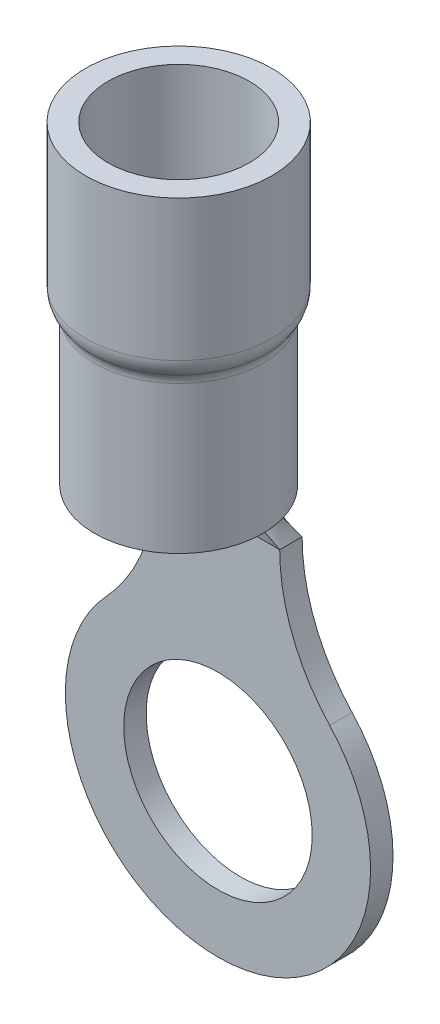
ISO-10303-21;
HEADER;
FILE_DESCRIPTION(('STEP AP214'),'2;1');
FILE_NAME('part.step','',(''),(''),'','','');
FILE_SCHEMA(('AUTOMOTIVE_DESIGN { 1 0 10303 214 1 1 1 1 }'));
ENDSEC;
DATA;
#1=APPLICATION_CONTEXT('core data for automotive mechanical design processes');
#2=APPLICATION_PROTOCOL_DEFINITION('international standard','automotive_design',2000,#1);
#3=PRODUCT_CONTEXT('',#1,'mechanical');
#4=PRODUCT('Part','Part','',(#3));
#5=PRODUCT_RELATED_PRODUCT_CATEGORY('part','',(#4));
#6=PRODUCT_DEFINITION_FORMATION('','',#4);
#7=PRODUCT_DEFINITION_CONTEXT('part definition',#1,'design');
#8=PRODUCT_DEFINITION('design','',#6,#7);
#9=PRODUCT_DEFINITION_SHAPE('','',#8);
#10=(LENGTH_UNIT() NAMED_UNIT(*) SI_UNIT(.MILLI.,.METRE.));
#11=(NAMED_UNIT(*) PLANE_ANGLE_UNIT() SI_UNIT($,.RADIAN.));
#12=(NAMED_UNIT(*) SI_UNIT($,.STERADIAN.) SOLID_ANGLE_UNIT());
#13=UNCERTAINTY_MEASURE_WITH_UNIT(LENGTH_MEASURE(1.E-05),#10,'distance_accuracy_value','');
#14=(GEOMETRIC_REPRESENTATION_CONTEXT(3) GLOBAL_UNCERTAINTY_ASSIGNED_CONTEXT((#13)) GLOBAL_UNIT_ASSIGNED_CONTEXT((#10,
#11,#12)) REPRESENTATION_CONTEXT('',''));
#15=CARTESIAN_POINT('',(0.,0.,0.));
#16=DIRECTION('',(0.,0.,1.));
#17=DIRECTION('',(1.,0.,0.));
#18=AXIS2_PLACEMENT_3D('',#15,#16,#17);
#19=CARTESIAN_POINT('',(0.,8.560050506339,2.75));
#20=DIRECTION('',(0.,1.,0.));
#21=DIRECTION('',(1.,0.,0.));
#22=AXIS2_PLACEMENT_3D('',#19,#20,#21);
#23=TOROIDAL_SURFACE('',#22,4.450000809119,0.7);
#24=CARTESIAN_POINT('',(0.,8.989699593222,2.75));
#25=DIRECTION('',(0.,-1.,0.));
#26=DIRECTION('',(1.,0.,0.));
#27=AXIS2_PLACEMENT_3D('',#24,#25,#26);
#28=CIRCLE('',#27,3.897369230189);
#29=CARTESIAN_POINT('',(3.897369230189,8.989699593222,2.75));
#30=VERTEX_POINT('',#29);
#31=EDGE_CURVE('P0_E27',#30,#30,#28,.T.);
#32=ORIENTED_EDGE('',*,*,#31,.T.);
#33=CARTESIAN_POINT('',(4.450000809119,8.560050506339,2.75));
#34=DIRECTION('',(0.,0.,1.));
#35=DIRECTION('',(1.,0.,0.));
#36=AXIS2_PLACEMENT_3D('',#33,#34,#35);
#37=CIRCLE('',#36,0.7);
#38=CARTESIAN_POINT('',(3.750000809119,8.560050506339,2.75));
#39=VERTEX_POINT('',#38);
#40=EDGE_CURVE('P0_E11',#30,#39,#37,.T.);
#41=ORIENTED_EDGE('',*,*,#40,.T.);
#42=CARTESIAN_POINT('',(0.,8.560050506339,2.75));
#43=DIRECTION('',(0.,-1.,0.));
#44=DIRECTION('',(1.,0.,0.));
#45=AXIS2_PLACEMENT_3D('',#42,#43,#44);
#46=CIRCLE('',#45,3.750000809119);
#47=EDGE_CURVE('P0_E122',#39,#39,#46,.T.);
#48=ORIENTED_EDGE('',*,*,#47,.F.);
#49=ORIENTED_EDGE('',*,*,#40,.F.);
#50=EDGE_LOOP('',(#32,#41,#48,#49));
#51=FACE_BOUND('',#50,.T.);
#52=ADVANCED_FACE('P0_F16',(#51),#23,.F.);
#53=CARTESIAN_POINT('',(0.,9.726240885055,2.75));
#54=DIRECTION('',(0.,-1.,0.));
#55=DIRECTION('',(1.,0.,0.));
#56=AXIS2_PLACEMENT_3D('',#53,#54,#55);
#57=TOROIDAL_SURFACE('',#56,2.950000809121,1.2);
#58=CARTESIAN_POINT('',(0.,9.726240885055,2.75));
#59=DIRECTION('',(0.,-1.,0.));
#60=DIRECTION('',(1.,0.,0.));
#61=AXIS2_PLACEMENT_3D('',#58,#59,#60);
#62=CIRCLE('',#61,4.150000809121);
#63=CARTESIAN_POINT('',(4.150000809121,9.726240885055,2.75));
#64=VERTEX_POINT('',#63);
#65=EDGE_CURVE('P0_E103',#64,#64,#62,.T.);
#66=ORIENTED_EDGE('',*,*,#65,.T.);
#67=CARTESIAN_POINT('',(2.950000809121,9.726240885055,2.75));
#68=DIRECTION('',(0.,0.,-1.));
#69=DIRECTION('',(1.,0.,0.));
#70=AXIS2_PLACEMENT_3D('',#67,#68,#69);
#71=CIRCLE('',#70,1.2);
#72=EDGE_CURVE('P0_E101',#64,#30,#71,.T.);
#73=ORIENTED_EDGE('',*,*,#72,.T.);
#74=ORIENTED_EDGE('',*,*,#31,.F.);
#75=ORIENTED_EDGE('',*,*,#72,.F.);
#76=EDGE_LOOP('',(#66,#73,#74,#75));
#77=FACE_BOUND('',#76,.T.);
#78=ADVANCED_FACE('P0_F167',(#77),#57,.T.);
#79=CARTESIAN_POINT('',(0.,9.726240885055,2.75));
#80=DIRECTION('',(0.,-1.,0.));
#81=DIRECTION('',(1.,0.,0.));
#82=AXIS2_PLACEMENT_3D('',#79,#80,#81);
#83=CYLINDRICAL_SURFACE('',#82,4.150000809121);
#84=CARTESIAN_POINT('',(0.,16.,2.75));
#85=DIRECTION('',(0.,-1.,0.));
#86=DIRECTION('',(1.,0.,0.));
#87=AXIS2_PLACEMENT_3D('',#84,#85,#86);
#88=CIRCLE('',#87,4.150000809121);
#89=CARTESIAN_POINT('',(4.150000809121,16.,2.75));
#90=VERTEX_POINT('',#89);
#91=EDGE_CURVE('P0_E95',#90,#90,#88,.T.);
#92=ORIENTED_EDGE('',*,*,#91,.T.);
#93=DIRECTION('',(0.,-1.,0.));
#94=VECTOR('',#93,1.);
#95=CARTESIAN_POINT('',(4.150000809121,9.726240885055,2.75));
#96=LINE('',#95,#94);
#97=EDGE_CURVE('P0_E112',#90,#64,#96,.T.);
#98=ORIENTED_EDGE('',*,*,#97,.T.);
#99=ORIENTED_EDGE('',*,*,#65,.F.);
#100=ORIENTED_EDGE('',*,*,#97,.F.);
#101=EDGE_LOOP('',(#92,#98,#99,#100));
#102=FACE_BOUND('',#101,.T.);
#103=ADVANCED_FACE('P0_F171',(#102),#83,.T.);
#104=CARTESIAN_POINT('',(0.,16.,2.75));
#105=DIRECTION('',(0.,-1.,0.));
#106=DIRECTION('',(-1.,0.,0.));
#107=AXIS2_PLACEMENT_3D('',#104,#105,#106);
#108=PLANE('',#107);
#109=ORIENTED_EDGE('',*,*,#91,.F.);
#110=EDGE_LOOP('',(#109));
#111=FACE_BOUND('',#110,.T.);
#112=CARTESIAN_POINT('',(0.,16.,2.75));
#113=DIRECTION('',(0.,-1.,0.));
#114=DIRECTION('',(1.,0.,0.));
#115=AXIS2_PLACEMENT_3D('',#112,#113,#114);
#116=CIRCLE('',#115,3.150000809121);
#117=CARTESIAN_POINT('',(3.150000809121,16.,2.75));
#118=VERTEX_POINT('',#117);
#119=EDGE_CURVE('P0_E88',#118,#118,#116,.T.);
#120=ORIENTED_EDGE('',*,*,#119,.T.);
#121=EDGE_LOOP('',(#120));
#122=FACE_BOUND('',#121,.T.);
#123=ADVANCED_FACE('P0_F162',(#111,#122),#108,.F.);
#124=CARTESIAN_POINT('',(0.,9.900000000002,2.75));
#125=DIRECTION('',(0.,1.,0.));
#126=DIRECTION('',(1.,0.,0.));
#127=AXIS2_PLACEMENT_3D('',#124,#125,#126);
#128=CYLINDRICAL_SURFACE('',#127,3.150000809121);
#129=CARTESIAN_POINT('',(0.,9.900000000002,2.75));
#130=DIRECTION('',(0.,-1.,0.));
#131=DIRECTION('',(1.,0.,0.));
#132=AXIS2_PLACEMENT_3D('',#129,#130,#131);
#133=CIRCLE('',#132,3.150000809121);
#134=CARTESIAN_POINT('',(3.150000809121,9.900000000002,2.75));
#135=VERTEX_POINT('',#134);
#136=EDGE_CURVE('P0_E87',#135,#135,#133,.T.);
#137=ORIENTED_EDGE('',*,*,#136,.T.);
#138=DIRECTION('',(0.,1.,0.));
#139=VECTOR('',#138,1.);
#140=CARTESIAN_POINT('',(3.150000809121,9.900000000002,2.75));
#141=LINE('',#140,#139);
#142=EDGE_CURVE('P0_E84',#135,#118,#141,.T.);
#143=ORIENTED_EDGE('',*,*,#142,.T.);
#144=ORIENTED_EDGE('',*,*,#119,.F.);
#145=ORIENTED_EDGE('',*,*,#142,.F.);
#146=EDGE_LOOP('',(#137,#143,#144,#145));
#147=FACE_BOUND('',#146,.T.);
#148=ADVANCED_FACE('P0_F85',(#147),#128,.F.);
#149=CARTESIAN_POINT('',(0.,8.5,2.75));
#150=DIRECTION('',(0.,1.,0.));
#151=DIRECTION('',(1.,0.,0.));
#152=AXIS2_PLACEMENT_3D('',#149,#150,#151);
#153=CONICAL_SURFACE('',#152,1.750000809121,0.785398163397);
#154=CARTESIAN_POINT('',(0.,8.5,2.75));
#155=DIRECTION('',(0.,-1.,0.));
#156=DIRECTION('',(1.,0.,0.));
#157=AXIS2_PLACEMENT_3D('',#154,#155,#156);
#158=CIRCLE('',#157,1.750000809121);
#159=CARTESIAN_POINT('',(1.750000809121,8.5,2.75));
#160=VERTEX_POINT('',#159);
#161=EDGE_CURVE('P0_E141',#160,#160,#158,.T.);
#162=ORIENTED_EDGE('',*,*,#161,.T.);
#163=DIRECTION('',(0.707106781186048,0.707106781187048,0.));
#164=VECTOR('',#163,1.);
#165=CARTESIAN_POINT('',(1.750000809121,8.5,2.75));
#166=LINE('',#165,#164);
#167=EDGE_CURVE('P0_E20',#160,#135,#166,.T.);
#168=ORIENTED_EDGE('',*,*,#167,.T.);
#169=ORIENTED_EDGE('',*,*,#136,.F.);
#170=ORIENTED_EDGE('',*,*,#167,.F.);
#171=EDGE_LOOP('',(#162,#168,#169,#170));
#172=FACE_BOUND('',#171,.T.);
#173=ADVANCED_FACE('P0_F151',(#172),#153,.F.);
#174=CARTESIAN_POINT('',(0.,8.5,2.75));
#175=DIRECTION('',(0.,-1.,0.));
#176=DIRECTION('',(-1.,0.,0.));
#177=AXIS2_PLACEMENT_3D('',#174,#175,#176);
#178=PLANE('',#177);
#179=ORIENTED_EDGE('',*,*,#161,.F.);
#180=EDGE_LOOP('',(#179));
#181=FACE_BOUND('',#180,.T.);
#182=CARTESIAN_POINT('',(0.,8.5,2.75));
#183=DIRECTION('',(0.,-1.,0.));
#184=DIRECTION('',(1.,0.,0.));
#185=AXIS2_PLACEMENT_3D('',#182,#183,#184);
#186=CIRCLE('',#185,2.750000809121);
#187=CARTESIAN_POINT('',(2.750000809121,8.5,2.75));
#188=VERTEX_POINT('',#187);
#189=EDGE_CURVE('P0_E66',#188,#188,#186,.T.);
#190=ORIENTED_EDGE('',*,*,#189,.T.);
#191=EDGE_LOOP('',(#190));
#192=FACE_BOUND('',#191,.T.);
#193=ADVANCED_FACE('P0_F153',(#181,#192),#178,.T.);
#194=CARTESIAN_POINT('',(0.,2.,2.75));
#195=DIRECTION('',(0.,1.,0.));
#196=DIRECTION('',(1.,0.,0.));
#197=AXIS2_PLACEMENT_3D('',#194,#195,#196);
#198=CYLINDRICAL_SURFACE('',#197,2.750000809121);
#199=CARTESIAN_POINT('',(0.,2.,2.75));
#200=DIRECTION('',(0.,-1.,0.));
#201=DIRECTION('',(1.,0.,0.));
#202=AXIS2_PLACEMENT_3D('',#199,#200,#201);
#203=CIRCLE('',#202,2.750000809121);
#204=CARTESIAN_POINT('',(2.750000809121,2.,2.75));
#205=VERTEX_POINT('',#204);
#206=EDGE_CURVE('P0_E136',#205,#205,#203,.T.);
#207=ORIENTED_EDGE('',*,*,#206,.T.);
#208=DIRECTION('',(0.,1.,0.));
#209=VECTOR('',#208,1.);
#210=CARTESIAN_POINT('',(2.750000809121,2.,2.75));
#211=LINE('',#210,#209);
#212=EDGE_CURVE('P0_E77',#205,#188,#211,.T.);
#213=ORIENTED_EDGE('',*,*,#212,.T.);
#214=ORIENTED_EDGE('',*,*,#189,.F.);
#215=ORIENTED_EDGE('',*,*,#212,.F.);
#216=EDGE_LOOP('',(#207,#213,#214,#215));
#217=FACE_BOUND('',#216,.T.);
#218=ADVANCED_FACE('P0_F18',(#217),#198,.F.);
#219=CARTESIAN_POINT('',(0.,2.,2.75));
#220=DIRECTION('',(0.,-1.,0.));
#221=DIRECTION('',(-1.,0.,0.));
#222=AXIS2_PLACEMENT_3D('',#219,#220,#221);
#223=PLANE('',#222);
#224=ORIENTED_EDGE('',*,*,#206,.F.);
#225=EDGE_LOOP('',(#224));
#226=FACE_BOUND('',#225,.T.);
#227=CARTESIAN_POINT('',(0.,2.,2.75));
#228=DIRECTION('',(0.,-1.,0.));
#229=DIRECTION('',(1.,0.,0.));
#230=AXIS2_PLACEMENT_3D('',#227,#228,#229);
#231=CIRCLE('',#230,3.750000809121);
#232=CARTESIAN_POINT('',(3.750000809121,2.,2.75));
#233=VERTEX_POINT('',#232);
#234=EDGE_CURVE('P0_E130',#233,#233,#231,.T.);
#235=ORIENTED_EDGE('',*,*,#234,.T.);
#236=EDGE_LOOP('',(#235));
#237=FACE_BOUND('',#236,.T.);
#238=ADVANCED_FACE('P0_F179',(#226,#237),#223,.T.);
#239=CARTESIAN_POINT('',(0.,2.,2.75));
#240=DIRECTION('',(0.,-1.,0.));
#241=DIRECTION('',(1.,0.,0.));
#242=AXIS2_PLACEMENT_3D('',#239,#240,#241);
#243=CYLINDRICAL_SURFACE('',#242,3.750000809121);
#244=ORIENTED_EDGE('',*,*,#47,.T.);
#245=DIRECTION('',(2.762E-13,-1.,0.));
#246=VECTOR('',#245,1.);
#247=CARTESIAN_POINT('',(3.750000809121,2.,2.75));
#248=LINE('',#247,#246);
#249=EDGE_CURVE('P0_E124',#39,#233,#248,.T.);
#250=ORIENTED_EDGE('',*,*,#249,.T.);
#251=ORIENTED_EDGE('',*,*,#234,.F.);
#252=ORIENTED_EDGE('',*,*,#249,.F.);
#253=EDGE_LOOP('',(#244,#250,#251,#252));
#254=FACE_BOUND('',#253,.T.);
#255=ADVANCED_FACE('P0_F177',(#254),#243,.T.);
#256=CLOSED_SHELL('',(#52,#78,#103,#123,#148,#173,#193,#218,#238,#255));
#257=MANIFOLD_SOLID_BREP('P0_B1',#256);
#258=CARTESIAN_POINT('',(8.0912104102E-07,2.,2.912542447599));
#259=DIRECTION('',(0.,-1.,0.));
#260=DIRECTION('',(-1.,0.,0.));
#261=AXIS2_PLACEMENT_3D('',#258,#259,#260);
#262=PLANE('',#261);
#263=CARTESIAN_POINT('',(8.091210403904E-07,2.,2.75));
#264=DIRECTION('',(0.,1.,0.));
#265=DIRECTION('',(1.,0.,0.));
#266=AXIS2_PLACEMENT_3D('',#263,#264,#265);
#267=CIRCLE('',#266,1.75);
#268=CARTESIAN_POINT('',(0.38888969801,2.,4.456243075326));
#269=VERTEX_POINT('',#268);
#270=CARTESIAN_POINT('',(8.09121000018218E-07,2.,1.));
#271=VERTEX_POINT('',#270);
#272=EDGE_CURVE('P1_E113',#269,#271,#267,.T.);
#273=ORIENTED_EDGE('',*,*,#272,.T.);
#274=DIRECTION('',(0.,0.,-1.));
#275=VECTOR('',#274,1.);
#276=CARTESIAN_POINT('',(8.09121000018218E-07,2.,2.912542447599));
#277=LINE('',#276,#275);
#278=CARTESIAN_POINT('',(8.09121000018218E-07,2.,0.));
#279=VERTEX_POINT('',#278);
#280=EDGE_CURVE('P1_E11',#271,#279,#277,.T.);
#281=ORIENTED_EDGE('',*,*,#280,.T.);
#282=CARTESIAN_POINT('',(8.091210403904E-07,2.,2.75));
#283=DIRECTION('',(0.,-1.,0.));
#284=DIRECTION('',(1.,0.,0.));
#285=AXIS2_PLACEMENT_3D('',#282,#283,#284);
#286=CIRCLE('',#285,2.75);
#287=CARTESIAN_POINT('',(0.611111920232,2.,5.431239118369));
#288=VERTEX_POINT('',#287);
#289=EDGE_CURVE('P1_E150',#279,#288,#286,.T.);
#290=ORIENTED_EDGE('',*,*,#289,.T.);
#291=CARTESIAN_POINT('',(0.500000809121,2.,4.943741096848));
#292=DIRECTION('',(0.,-1.,0.));
#293=DIRECTION('',(1.,0.,0.));
#294=AXIS2_PLACEMENT_3D('',#291,#292,#293);
#295=CIRCLE('',#294,0.5);
#296=CARTESIAN_POINT('',(8.09121000018218E-07,2.,4.943741096848));
#297=VERTEX_POINT('',#296);
#298=EDGE_CURVE('P1_E122',#288,#297,#295,.T.);
#299=ORIENTED_EDGE('',*,*,#298,.T.);
#300=EDGE_CURVE('P1_E127',#297,#269,#295,.T.);
#301=ORIENTED_EDGE('',*,*,#300,.T.);
#302=EDGE_LOOP('',(#273,#281,#290,#299,#301));
#303=FACE_BOUND('',#302,.T.);
#304=ADVANCED_FACE('P1_F16',(#303),#262,.T.);
#305=CARTESIAN_POINT('',(8.0912104102E-07,8.5,2.912542447599));
#306=DIRECTION('',(0.,-1.,0.));
#307=DIRECTION('',(-1.,0.,0.));
#308=AXIS2_PLACEMENT_3D('',#305,#306,#307);
#309=PLANE('',#308);
#310=CARTESIAN_POINT('',(8.091210403904E-07,8.5,2.75));
#311=DIRECTION('',(0.,1.,0.));
#312=DIRECTION('',(1.,0.,0.));
#313=AXIS2_PLACEMENT_3D('',#310,#311,#312);
#314=CIRCLE('',#313,1.75);
#315=CARTESIAN_POINT('',(8.09121000018218E-07,8.5,1.));
#316=VERTEX_POINT('',#315);
#317=CARTESIAN_POINT('',(-0.388888079768,8.5,4.456243075326));
#318=VERTEX_POINT('',#317);
#319=EDGE_CURVE('P1_E109',#316,#318,#314,.T.);
#320=ORIENTED_EDGE('',*,*,#319,.F.);
#321=DIRECTION('',(0.,0.,-1.));
#322=VECTOR('',#321,1.);
#323=CARTESIAN_POINT('',(8.09121000018218E-07,8.5,2.912542447599));
#324=LINE('',#323,#322);
#325=CARTESIAN_POINT('',(8.09121000018218E-07,8.5,0.));
#326=VERTEX_POINT('',#325);
#327=EDGE_CURVE('P1_E24',#316,#326,#324,.T.);
#328=ORIENTED_EDGE('',*,*,#327,.T.);
#329=CARTESIAN_POINT('',(8.091210403904E-07,8.5,2.75));
#330=DIRECTION('',(0.,-1.,0.));
#331=DIRECTION('',(1.,0.,0.));
#332=AXIS2_PLACEMENT_3D('',#329,#330,#331);
#333=CIRCLE('',#332,2.75);
#334=CARTESIAN_POINT('',(-0.61111030199,8.5,5.431239118369));
#335=VERTEX_POINT('',#334);
#336=EDGE_CURVE('P1_E143',#335,#326,#333,.T.);
#337=ORIENTED_EDGE('',*,*,#336,.F.);
#338=CARTESIAN_POINT('',(-0.499999190879,8.5,4.943741096848));
#339=DIRECTION('',(0.,-1.,0.));
#340=DIRECTION('',(1.,0.,0.));
#341=AXIS2_PLACEMENT_3D('',#338,#339,#340);
#342=CIRCLE('',#341,0.5);
#343=CARTESIAN_POINT('',(8.09121000018218E-07,8.5,4.943741096848));
#344=VERTEX_POINT('',#343);
#345=EDGE_CURVE('P1_E134',#344,#335,#342,.T.);
#346=ORIENTED_EDGE('',*,*,#345,.F.);
#347=EDGE_CURVE('P1_E151',#318,#344,#342,.T.);
#348=ORIENTED_EDGE('',*,*,#347,.F.);
#349=EDGE_LOOP('',(#320,#328,#337,#346,#348));
#350=FACE_BOUND('',#349,.T.);
#351=ADVANCED_FACE('P1_F179',(#350),#309,.F.);
#352=ORIENTED_EDGE('',*,*,#327,.F.);
#353=CARTESIAN_POINT('',(0.38888969801,8.5,4.456243075326));
#354=VERTEX_POINT('',#353);
#355=EDGE_CURVE('P1_E102',#354,#316,#314,.T.);
#356=ORIENTED_EDGE('',*,*,#355,.F.);
#357=CARTESIAN_POINT('',(0.500000809121,8.5,4.943741096848));
#358=DIRECTION('',(0.,-1.,0.));
#359=DIRECTION('',(1.,0.,0.));
#360=AXIS2_PLACEMENT_3D('',#357,#358,#359);
#361=CIRCLE('',#360,0.5);
#362=CARTESIAN_POINT('',(8.09121000018218E-07,8.5,4.943741096848));
#363=VERTEX_POINT('',#362);
#364=EDGE_CURVE('P1_E89',#363,#354,#361,.T.);
#365=ORIENTED_EDGE('',*,*,#364,.F.);
#366=CARTESIAN_POINT('',(0.611111920232,8.5,5.431239118369));
#367=VERTEX_POINT('',#366);
#368=EDGE_CURVE('P1_E96',#367,#363,#361,.T.);
#369=ORIENTED_EDGE('',*,*,#368,.F.);
#370=EDGE_CURVE('P1_E141',#326,#367,#333,.T.);
#371=ORIENTED_EDGE('',*,*,#370,.F.);
#372=EDGE_LOOP('',(#352,#356,#365,#369,#371));
#373=FACE_BOUND('',#372,.T.);
#374=ADVANCED_FACE('P1_F103',(#373),#309,.F.);
#375=ORIENTED_EDGE('',*,*,#280,.F.);
#376=CARTESIAN_POINT('',(-0.388888079768,2.,4.456243075326));
#377=VERTEX_POINT('',#376);
#378=EDGE_CURVE('P1_E135',#271,#377,#267,.T.);
#379=ORIENTED_EDGE('',*,*,#378,.T.);
#380=CARTESIAN_POINT('',(-0.499999190879,2.,4.943741096848));
#381=DIRECTION('',(0.,-1.,0.));
#382=DIRECTION('',(1.,0.,0.));
#383=AXIS2_PLACEMENT_3D('',#380,#381,#382);
#384=CIRCLE('',#383,0.5);
#385=CARTESIAN_POINT('',(8.09121000018218E-07,2.,4.943741096848));
#386=VERTEX_POINT('',#385);
#387=EDGE_CURVE('P1_E137',#377,#386,#384,.T.);
#388=ORIENTED_EDGE('',*,*,#387,.T.);
#389=CARTESIAN_POINT('',(-0.61111030199,2.,5.431239118369));
#390=VERTEX_POINT('',#389);
#391=EDGE_CURVE('P1_E142',#386,#390,#384,.T.);
#392=ORIENTED_EDGE('',*,*,#391,.T.);
#393=EDGE_CURVE('P1_E99',#390,#279,#286,.T.);
#394=ORIENTED_EDGE('',*,*,#393,.T.);
#395=EDGE_LOOP('',(#375,#379,#388,#392,#394));
#396=FACE_BOUND('',#395,.T.);
#397=ADVANCED_FACE('P1_F172',(#396),#262,.T.);
#398=CARTESIAN_POINT('',(0.500000809121,2.,4.943741096848));
#399=DIRECTION('',(0.,-1.,0.));
#400=DIRECTION('',(1.,0.,0.));
#401=AXIS2_PLACEMENT_3D('',#398,#399,#400);
#402=CYLINDRICAL_SURFACE('',#401,0.5);
#403=DIRECTION('',(0.,1.,0.));
#404=VECTOR('',#403,1.);
#405=CARTESIAN_POINT('',(0.611111920232,2.,5.431239118369));
#406=LINE('',#405,#404);
#407=EDGE_CURVE('P1_E147',#288,#367,#406,.T.);
#408=ORIENTED_EDGE('',*,*,#407,.T.);
#409=ORIENTED_EDGE('',*,*,#368,.T.);
#410=ORIENTED_EDGE('',*,*,#364,.T.);
#411=DIRECTION('',(0.,1.,0.));
#412=VECTOR('',#411,1.);
#413=CARTESIAN_POINT('',(0.38888969801,2.,4.456243075326));
#414=LINE('',#413,#412);
#415=EDGE_CURVE('P1_E94',#269,#354,#414,.T.);
#416=ORIENTED_EDGE('',*,*,#415,.F.);
#417=ORIENTED_EDGE('',*,*,#300,.F.);
#418=ORIENTED_EDGE('',*,*,#298,.F.);
#419=EDGE_LOOP('',(#408,#409,#410,#416,#417,#418));
#420=FACE_BOUND('',#419,.T.);
#421=ADVANCED_FACE('P1_F92',(#420),#402,.T.);
#422=CARTESIAN_POINT('',(8.0912104039E-07,2.,2.75));
#423=DIRECTION('',(0.,-1.,0.));
#424=DIRECTION('',(1.,0.,0.));
#425=AXIS2_PLACEMENT_3D('',#422,#423,#424);
#426=CYLINDRICAL_SURFACE('',#425,2.75);
#427=DIRECTION('',(0.,1.,0.));
#428=VECTOR('',#427,1.);
#429=CARTESIAN_POINT('',(-0.61111030199,2.,5.431239118369));
#430=LINE('',#429,#428);
#431=EDGE_CURVE('P1_E121',#390,#335,#430,.T.);
#432=ORIENTED_EDGE('',*,*,#431,.T.);
#433=ORIENTED_EDGE('',*,*,#336,.T.);
#434=ORIENTED_EDGE('',*,*,#370,.T.);
#435=ORIENTED_EDGE('',*,*,#407,.F.);
#436=ORIENTED_EDGE('',*,*,#289,.F.);
#437=ORIENTED_EDGE('',*,*,#393,.F.);
#438=EDGE_LOOP('',(#432,#433,#434,#435,#436,#437));
#439=FACE_BOUND('',#438,.T.);
#440=ADVANCED_FACE('P1_F18',(#439),#426,.T.);
#441=CARTESIAN_POINT('',(-0.499999190879,2.,4.943741096848));
#442=DIRECTION('',(0.,-1.,0.));
#443=DIRECTION('',(1.,0.,0.));
#444=AXIS2_PLACEMENT_3D('',#441,#442,#443);
#445=CYLINDRICAL_SURFACE('',#444,0.5);
#446=DIRECTION('',(0.,1.,0.));
#447=VECTOR('',#446,1.);
#448=CARTESIAN_POINT('',(-0.388888079768,2.,4.456243075326));
#449=LINE('',#448,#447);
#450=EDGE_CURVE('P1_E108',#377,#318,#449,.T.);
#451=ORIENTED_EDGE('',*,*,#450,.T.);
#452=ORIENTED_EDGE('',*,*,#347,.T.);
#453=ORIENTED_EDGE('',*,*,#345,.T.);
#454=ORIENTED_EDGE('',*,*,#431,.F.);
#455=ORIENTED_EDGE('',*,*,#391,.F.);
#456=ORIENTED_EDGE('',*,*,#387,.F.);
#457=EDGE_LOOP('',(#451,#452,#453,#454,#455,#456));
#458=FACE_BOUND('',#457,.T.);
#459=ADVANCED_FACE('P1_F176',(#458),#445,.T.);
#460=CARTESIAN_POINT('',(8.0912104039E-07,2.,2.75));
#461=DIRECTION('',(0.,-1.,0.));
#462=DIRECTION('',(1.,0.,0.));
#463=AXIS2_PLACEMENT_3D('',#460,#461,#462);
#464=CYLINDRICAL_SURFACE('',#463,1.75);
#465=ORIENTED_EDGE('',*,*,#415,.T.);
#466=ORIENTED_EDGE('',*,*,#355,.T.);
#467=ORIENTED_EDGE('',*,*,#319,.T.);
#468=ORIENTED_EDGE('',*,*,#450,.F.);
#469=ORIENTED_EDGE('',*,*,#378,.F.);
#470=ORIENTED_EDGE('',*,*,#272,.F.);
#471=EDGE_LOOP('',(#465,#466,#467,#468,#469,#470));
#472=FACE_BOUND('',#471,.T.);
#473=ADVANCED_FACE('P1_F112',(#472),#464,.F.);
#474=CLOSED_SHELL('',(#304,#351,#374,#397,#421,#440,#459,#473));
#475=MANIFOLD_SOLID_BREP('P1_B1',#474);
#476=CARTESIAN_POINT('',(-2.749999190879,0.,1.));
#477=DIRECTION('',(0.,-1.,0.));
#478=DIRECTION('',(-1.,0.,0.));
#479=AXIS2_PLACEMENT_3D('',#476,#477,#478);
#480=PLANE('',#479);
#481=DIRECTION('',(1.,0.,0.));
#482=VECTOR('',#481,1.);
#483=CARTESIAN_POINT('',(-2.749999190879,0.,1.));
#484=LINE('',#483,#482);
#485=CARTESIAN_POINT('',(-2.749999190879,0.,1.));
#486=VERTEX_POINT('',#485);
#487=CARTESIAN_POINT('',(2.750000809121,0.,1.));
#488=VERTEX_POINT('',#487);
#489=EDGE_CURVE('P2_E86',#486,#488,#484,.T.);
#490=ORIENTED_EDGE('',*,*,#489,.F.);
#491=DIRECTION('',(0.,0.,1.));
#492=VECTOR('',#491,1.);
#493=CARTESIAN_POINT('',(-2.749999190879,0.,-4.534150832569E-13));
#494=LINE('',#493,#492);
#495=CARTESIAN_POINT('',(-2.749999190879,0.,-4.534150832569E-13));
#496=VERTEX_POINT('',#495);
#497=EDGE_CURVE('P2_E81',#496,#486,#494,.T.);
#498=ORIENTED_EDGE('',*,*,#497,.F.);
#499=DIRECTION('',(-1.,0.,0.));
#500=VECTOR('',#499,1.);
#501=CARTESIAN_POINT('',(2.750000809121,0.,-4.534150832569E-13));
#502=LINE('',#501,#500);
#503=CARTESIAN_POINT('',(2.750000809121,0.,-4.534150832569E-13));
#504=VERTEX_POINT('',#503);
#505=EDGE_CURVE('P2_E20',#504,#496,#502,.T.);
#506=ORIENTED_EDGE('',*,*,#505,.F.);
#507=DIRECTION('',(0.,0.,-1.));
#508=VECTOR('',#507,1.);
#509=CARTESIAN_POINT('',(2.750000809121,0.,1.));
#510=LINE('',#509,#508);
#511=EDGE_CURVE('P2_E11',#488,#504,#510,.T.);
#512=ORIENTED_EDGE('',*,*,#511,.F.);
#513=EDGE_LOOP('',(#490,#498,#506,#512));
#514=FACE_BOUND('',#513,.T.);
#515=ADVANCED_FACE('P2_F16',(#514),#480,.T.);
#516=CARTESIAN_POINT('',(8.0912104039E-07,2.,2.75));
#517=DIRECTION('',(0.,1.,0.));
#518=DIRECTION('',(0.,0.,-1.));
#519=AXIS2_PLACEMENT_3D('',#516,#517,#518);
#520=PLANE('',#519);
#521=DIRECTION('',(-0.866025403784329,0.,0.50000000000019));
#522=VECTOR('',#521,1.);
#523=CARTESIAN_POINT('',(1.515545265744,2.,1.875));
#524=LINE('',#523,#522);
#525=CARTESIAN_POINT('',(2.381570669528,2.,1.375));
#526=VERTEX_POINT('',#525);
#527=CARTESIAN_POINT('',(1.515545265744,2.,1.875));
#528=VERTEX_POINT('',#527);
#529=EDGE_CURVE('P2_E27',#526,#528,#524,.T.);
#530=ORIENTED_EDGE('',*,*,#529,.F.);
#531=CARTESIAN_POINT('',(8.091210403904E-07,2.,2.75));
#532=DIRECTION('',(0.,-1.,0.));
#533=DIRECTION('',(1.,0.,0.));
#534=AXIS2_PLACEMENT_3D('',#531,#532,#533);
#535=CIRCLE('',#534,2.75);
#536=CARTESIAN_POINT('',(-2.381569051286,2.,1.375));
#537=VERTEX_POINT('',#536);
#538=EDGE_CURVE('P2_E69',#537,#526,#535,.T.);
#539=ORIENTED_EDGE('',*,*,#538,.F.);
#540=DIRECTION('',(-0.866025403784329,0.,-0.50000000000019));
#541=VECTOR('',#540,1.);
#542=CARTESIAN_POINT('',(-1.515543647502,2.,1.875));
#543=LINE('',#542,#541);
#544=CARTESIAN_POINT('',(-1.515543647502,2.,1.875));
#545=VERTEX_POINT('',#544);
#546=EDGE_CURVE('P2_E64',#545,#537,#543,.T.);
#547=ORIENTED_EDGE('',*,*,#546,.F.);
#548=CARTESIAN_POINT('',(8.091210403904E-07,2.,2.75));
#549=DIRECTION('',(0.,1.,0.));
#550=DIRECTION('',(1.,0.,0.));
#551=AXIS2_PLACEMENT_3D('',#548,#549,#550);
#552=CIRCLE('',#551,1.75);
#553=EDGE_CURVE('P2_E67',#528,#545,#552,.T.);
#554=ORIENTED_EDGE('',*,*,#553,.F.);
#555=EDGE_LOOP('',(#530,#539,#547,#554));
#556=FACE_BOUND('',#555,.T.);
#557=ADVANCED_FACE('P2_F18',(#556),#520,.T.);
#558=CARTESIAN_POINT('',(2.381570669528,2.,1.375));
#559=CARTESIAN_POINT('',(2.750000809121,0.,-4.534150832569E-13));
#560=CARTESIAN_POINT('',(1.515545265744,2.,1.875));
#561=CARTESIAN_POINT('',(2.750000809121,0.,1.));
#562=(BOUNDED_SURFACE() B_SPLINE_SURFACE(1,1,((#558,#559),(#560,#561)),.UNSPECIFIED.,.F.,.F.,
.F.) B_SPLINE_SURFACE_WITH_KNOTS((2,2),(2,2),(-1.,0.),(0.,1.),
.UNSPECIFIED.) GEOMETRIC_REPRESENTATION_ITEM() RATIONAL_B_SPLINE_SURFACE(((1.,1.),(1.,1.))) REPRESENTATION_ITEM('') SURFACE());
#563=CARTESIAN_POINT('',(1.515545265744,2.,1.875));
#564=CARTESIAN_POINT('',(2.750000809121,0.,1.));
#565=(BOUNDED_CURVE() B_SPLINE_CURVE(1,(#563,#564),.UNSPECIFIED.,.F.,
.F.) B_SPLINE_CURVE_WITH_KNOTS((2,2),(0.,1.),
.UNSPECIFIED.) CURVE() GEOMETRIC_REPRESENTATION_ITEM() RATIONAL_B_SPLINE_CURVE((1.,1.)) REPRESENTATION_ITEM(''));
#566=EDGE_CURVE('P2_E75',#528,#488,#565,.T.);
#567=CARTESIAN_POINT('',(2.381570669528,2.,1.375));
#568=CARTESIAN_POINT('',(2.750000809121,0.,-4.538591724668E-13));
#569=(BOUNDED_CURVE() B_SPLINE_CURVE(1,(#567,#568),.UNSPECIFIED.,.F.,
.F.) B_SPLINE_CURVE_WITH_KNOTS((2,2),(0.,1.),
.UNSPECIFIED.) CURVE() GEOMETRIC_REPRESENTATION_ITEM() RATIONAL_B_SPLINE_CURVE((1.,1.)) REPRESENTATION_ITEM(''));
#570=EDGE_CURVE('P2_E117',#526,#504,#569,.T.);
#571=ORIENTED_EDGE('',*,*,#529,.T.);
#572=ORIENTED_EDGE('',*,*,#566,.T.);
#573=ORIENTED_EDGE('',*,*,#511,.T.);
#574=ORIENTED_EDGE('',*,*,#570,.F.);
#575=EDGE_LOOP('',(#571,#572,#573,#574));
#576=FACE_BOUND('',#575,.T.);
#577=ADVANCED_FACE('P2_F137',(#576),#562,.T.);
#578=CARTESIAN_POINT('',(-2.381569051286,2.,1.375));
#579=CARTESIAN_POINT('',(-2.749999190879,0.,-4.538591724668E-13));
#580=CARTESIAN_POINT('',(-2.061592021754,2.,0.820783527595));
#581=CARTESIAN_POINT('',(-2.138888079768,0.,-4.538591724668E-13));
#582=CARTESIAN_POINT('',(-1.596521471291,2.,0.350336666047));
#583=CARTESIAN_POINT('',(-1.527776968657,0.,-4.538591724668E-13));
#584=CARTESIAN_POINT('',(-1.011421134632,2.,0.007072835328612));
#585=CARTESIAN_POINT('',(-0.916665857546,0.,-4.538591724668E-13));
#586=CARTESIAN_POINT('',(-0.346509176676,2.,-0.174351499719));
#587=CARTESIAN_POINT('',(-0.305554746435,0.,-4.538591724668E-13));
#588=CARTESIAN_POINT('',(0.346510794918,2.,-0.17435149972));
#589=CARTESIAN_POINT('',(0.305556364677,0.,-4.538591724668E-13));
#590=CARTESIAN_POINT('',(1.011422752874,2.,0.007072835329166));
#591=CARTESIAN_POINT('',(0.916667475788,0.,-4.538591724668E-13));
#592=CARTESIAN_POINT('',(1.596523089533,2.,0.350336666047));
#593=CARTESIAN_POINT('',(1.527778586899,0.,-4.538591724668E-13));
#594=CARTESIAN_POINT('',(2.061593639996,2.,0.820783527595));
#595=CARTESIAN_POINT('',(2.13888969801,0.,-4.538591724668E-13));
#596=CARTESIAN_POINT('',(2.381570669528,2.,1.375));
#597=CARTESIAN_POINT('',(2.750000809121,0.,-4.538591724668E-13));
#598=(BOUNDED_SURFACE() B_SPLINE_SURFACE(9,1,((#578,#579),(#580,#581),(#582,#583),(#584,#585),
(#586,#587),(#588,#589),(#590,#591),(#592,#593),(#594,#595),(#596,#597)),.UNSPECIFIED.,.F.,.F.,
.F.) B_SPLINE_SURFACE_WITH_KNOTS((10,10),(2,2),(-5.5,0.),(0.,1.),
.UNSPECIFIED.) GEOMETRIC_REPRESENTATION_ITEM() RATIONAL_B_SPLINE_SURFACE(((1.,1.),(1.,1.),(1.,
1.),(1.,1.),(1.,1.),(1.,1.),(1.,1.),(1.,1.),(1.,1.),(1.,1.))) REPRESENTATION_ITEM('') SURFACE());
#599=CARTESIAN_POINT('',(-2.381569051286,2.,1.375));
#600=CARTESIAN_POINT('',(-2.749999190879,0.,-4.534150832569E-13));
#601=(BOUNDED_CURVE() B_SPLINE_CURVE(1,(#599,#600),.UNSPECIFIED.,.F.,
.F.) B_SPLINE_CURVE_WITH_KNOTS((2,2),(0.,1.),
.UNSPECIFIED.) CURVE() GEOMETRIC_REPRESENTATION_ITEM() RATIONAL_B_SPLINE_CURVE((1.,1.)) REPRESENTATION_ITEM(''));
#602=EDGE_CURVE('P2_E74',#537,#496,#601,.T.);
#603=ORIENTED_EDGE('',*,*,#538,.T.);
#604=ORIENTED_EDGE('',*,*,#570,.T.);
#605=ORIENTED_EDGE('',*,*,#505,.T.);
#606=ORIENTED_EDGE('',*,*,#602,.F.);
#607=EDGE_LOOP('',(#603,#604,#605,#606));
#608=FACE_BOUND('',#607,.T.);
#609=ADVANCED_FACE('P2_F139',(#608),#598,.T.);
#610=CARTESIAN_POINT('',(-1.515543647502,2.,1.875));
#611=CARTESIAN_POINT('',(-2.749999190879,0.,1.));
#612=CARTESIAN_POINT('',(-2.381569051286,2.,1.375));
#613=CARTESIAN_POINT('',(-2.749999190879,0.,-4.534150832569E-13));
#614=(BOUNDED_SURFACE() B_SPLINE_SURFACE(1,1,((#610,#611),(#612,#613)),.UNSPECIFIED.,.F.,.F.,
.F.) B_SPLINE_SURFACE_WITH_KNOTS((2,2),(2,2),(0.,1.),(0.,1.),
.UNSPECIFIED.) GEOMETRIC_REPRESENTATION_ITEM() RATIONAL_B_SPLINE_SURFACE(((1.,1.),(1.,1.))) REPRESENTATION_ITEM('') SURFACE());
#615=CARTESIAN_POINT('',(-1.515543647502,2.,1.875));
#616=CARTESIAN_POINT('',(-2.749999190879,0.,1.));
#617=(BOUNDED_CURVE() B_SPLINE_CURVE(1,(#615,#616),.UNSPECIFIED.,.F.,
.F.) B_SPLINE_CURVE_WITH_KNOTS((2,2),(0.,1.),
.UNSPECIFIED.) CURVE() GEOMETRIC_REPRESENTATION_ITEM() RATIONAL_B_SPLINE_CURVE((1.,1.)) REPRESENTATION_ITEM(''));
#618=EDGE_CURVE('P2_E78',#545,#486,#617,.T.);
#619=ORIENTED_EDGE('',*,*,#546,.T.);
#620=ORIENTED_EDGE('',*,*,#602,.T.);
#621=ORIENTED_EDGE('',*,*,#497,.T.);
#622=ORIENTED_EDGE('',*,*,#618,.F.);
#623=EDGE_LOOP('',(#619,#620,#621,#622));
#624=FACE_BOUND('',#623,.T.);
#625=ADVANCED_FACE('P2_F79',(#624),#614,.T.);
#626=CARTESIAN_POINT('',(1.515545265744,2.,1.875));
#627=CARTESIAN_POINT('',(2.750000809121,0.,1.));
#628=CARTESIAN_POINT('',(1.28647080142,2.,1.478231389073));
#629=CARTESIAN_POINT('',(2.062500809121,0.,1.));
#630=CARTESIAN_POINT('',(0.938681550309,2.,1.150001550667));
#631=CARTESIAN_POINT('',(1.375000809121,0.,1.));
#632=CARTESIAN_POINT('',(0.496117234674,2.,0.93175056748));
#633=CARTESIAN_POINT('',(0.687500809121,0.,1.));
#634=CARTESIAN_POINT('',(8.0912106959E-07,2.,0.854887828154));
#635=CARTESIAN_POINT('',(8.091210439E-07,0.,1.));
#636=CARTESIAN_POINT('',(-0.496115616432,2.,0.93175056748));
#637=CARTESIAN_POINT('',(-0.687499190879,0.,1.));
#638=CARTESIAN_POINT('',(-0.938679932067,2.,1.150001550667));
#639=CARTESIAN_POINT('',(-1.374999190879,0.,1.));
#640=CARTESIAN_POINT('',(-1.286469183178,2.,1.478231389073));
#641=CARTESIAN_POINT('',(-2.062499190879,0.,1.));
#642=CARTESIAN_POINT('',(-1.515543647502,2.,1.875));
#643=CARTESIAN_POINT('',(-2.749999190879,0.,1.));
#644=(BOUNDED_SURFACE() B_SPLINE_SURFACE(8,1,((#626,#627),(#628,#629),(#630,#631),(#632,#633),
(#634,#635),(#636,#637),(#638,#639),(#640,#641),(#642,#643)),.UNSPECIFIED.,.F.,.F.,
.F.) B_SPLINE_SURFACE_WITH_KNOTS((9,9),(2,2),(-5.5,0.),(0.,1.),
.UNSPECIFIED.) GEOMETRIC_REPRESENTATION_ITEM() RATIONAL_B_SPLINE_SURFACE(((1.,1.),(1.,1.),(1.,
1.),(1.,1.),(1.,1.),(1.,1.),(1.,1.),(1.,1.),(1.,1.))) REPRESENTATION_ITEM('') SURFACE());
#645=ORIENTED_EDGE('',*,*,#553,.T.);
#646=ORIENTED_EDGE('',*,*,#618,.T.);
#647=ORIENTED_EDGE('',*,*,#489,.T.);
#648=ORIENTED_EDGE('',*,*,#566,.F.);
#649=EDGE_LOOP('',(#645,#646,#647,#648));
#650=FACE_BOUND('',#649,.T.);
#651=ADVANCED_FACE('P2_F88',(#650),#644,.T.);
#652=CLOSED_SHELL('',(#515,#557,#577,#609,#625,#651));
#653=MANIFOLD_SOLID_BREP('P2_B1',#652);
#654=CARTESIAN_POINT('',(0.,-8.842268594636,1.));
#655=DIRECTION('',(0.,0.,1.));
#656=DIRECTION('',(1.,0.,0.));
#657=AXIS2_PLACEMENT_3D('',#654,#655,#656);
#658=PLANE('',#657);
#659=CARTESIAN_POINT('',(0.,-10.3,1.));
#660=DIRECTION('',(0.,0.,1.));
#661=DIRECTION('',(1.,0.,0.));
#662=AXIS2_PLACEMENT_3D('',#659,#660,#661);
#663=CIRCLE('',#662,4.2);
#664=CARTESIAN_POINT('',(4.2,-10.3,1.));
#665=VERTEX_POINT('',#664);
#666=EDGE_CURVE('P3_E20',#665,#665,#663,.T.);
#667=ORIENTED_EDGE('',*,*,#666,.F.);
#668=EDGE_LOOP('',(#667));
#669=FACE_BOUND('',#668,.T.);
#670=CARTESIAN_POINT('',(-11.07253086418,0.,1.));
#671=DIRECTION('',(0.,0.,1.));
#672=DIRECTION('',(1.,0.,0.));
#673=AXIS2_PLACEMENT_3D('',#670,#671,#672);
#674=CIRCLE('',#673,8.322530864182);
#675=CARTESIAN_POINT('',(-4.978876257728,-5.668500112246,1.));
#676=VERTEX_POINT('',#675);
#677=CARTESIAN_POINT('',(-2.75,0.,1.));
#678=VERTEX_POINT('',#677);
#679=EDGE_CURVE('P3_E107',#676,#678,#674,.T.);
#680=ORIENTED_EDGE('',*,*,#679,.F.);
#681=CARTESIAN_POINT('',(0.,-10.3,1.));
#682=DIRECTION('',(0.,0.,1.));
#683=DIRECTION('',(1.,0.,0.));
#684=AXIS2_PLACEMENT_3D('',#681,#682,#683);
#685=CIRCLE('',#684,6.8);
#686=CARTESIAN_POINT('',(4.978876257728,-5.668500112246,1.));
#687=VERTEX_POINT('',#686);
#688=EDGE_CURVE('P3_E61',#676,#687,#685,.T.);
#689=ORIENTED_EDGE('',*,*,#688,.T.);
#690=CARTESIAN_POINT('',(11.072530864182,0.,1.));
#691=DIRECTION('',(0.,0.,1.));
#692=DIRECTION('',(1.,0.,0.));
#693=AXIS2_PLACEMENT_3D('',#690,#691,#692);
#694=CIRCLE('',#693,8.322530864182);
#695=CARTESIAN_POINT('',(2.75,0.,1.));
#696=VERTEX_POINT('',#695);
#697=EDGE_CURVE('P3_E116',#696,#687,#694,.T.);
#698=ORIENTED_EDGE('',*,*,#697,.F.);
#699=DIRECTION('',(1.,0.,0.));
#700=VECTOR('',#699,1.);
#701=CARTESIAN_POINT('',(-2.75,0.,1.));
#702=LINE('',#701,#700);
#703=EDGE_CURVE('P3_E99',#678,#696,#702,.T.);
#704=ORIENTED_EDGE('',*,*,#703,.F.);
#705=EDGE_LOOP('',(#680,#689,#698,#704));
#706=FACE_BOUND('',#705,.T.);
#707=ADVANCED_FACE('P3_F16',(#669,#706),#658,.T.);
#708=CARTESIAN_POINT('',(0.,-8.842268594636,0.));
#709=DIRECTION('',(0.,0.,1.));
#710=DIRECTION('',(1.,0.,0.));
#711=AXIS2_PLACEMENT_3D('',#708,#709,#710);
#712=PLANE('',#711);
#713=CARTESIAN_POINT('',(0.,-10.3,0.));
#714=DIRECTION('',(0.,0.,1.));
#715=DIRECTION('',(1.,0.,0.));
#716=AXIS2_PLACEMENT_3D('',#713,#714,#715);
#717=CIRCLE('',#716,4.2);
#718=CARTESIAN_POINT('',(4.2,-10.3,0.));
#719=VERTEX_POINT('',#718);
#720=EDGE_CURVE('P3_E11',#719,#719,#717,.T.);
#721=ORIENTED_EDGE('',*,*,#720,.T.);
#722=EDGE_LOOP('',(#721));
#723=FACE_BOUND('',#722,.T.);
#724=DIRECTION('',(1.,0.,0.));
#725=VECTOR('',#724,1.);
#726=CARTESIAN_POINT('',(-2.75,0.,0.));
#727=LINE('',#726,#725);
#728=CARTESIAN_POINT('',(-2.75,0.,0.));
#729=VERTEX_POINT('',#728);
#730=CARTESIAN_POINT('',(2.75,0.,0.));
#731=VERTEX_POINT('',#730);
#732=EDGE_CURVE('P3_E89',#729,#731,#727,.T.);
#733=ORIENTED_EDGE('',*,*,#732,.T.);
#734=CARTESIAN_POINT('',(11.072530864182,0.,0.));
#735=DIRECTION('',(0.,0.,1.));
#736=DIRECTION('',(1.,0.,0.));
#737=AXIS2_PLACEMENT_3D('',#734,#735,#736);
#738=CIRCLE('',#737,8.322530864182);
#739=CARTESIAN_POINT('',(4.978876257728,-5.668500112246,0.));
#740=VERTEX_POINT('',#739);
#741=EDGE_CURVE('P3_E80',#731,#740,#738,.T.);
#742=ORIENTED_EDGE('',*,*,#741,.T.);
#743=CARTESIAN_POINT('',(0.,-10.3,0.));
#744=DIRECTION('',(0.,0.,1.));
#745=DIRECTION('',(1.,0.,0.));
#746=AXIS2_PLACEMENT_3D('',#743,#744,#745);
#747=CIRCLE('',#746,6.8);
#748=CARTESIAN_POINT('',(-4.978876257728,-5.668500112246,0.));
#749=VERTEX_POINT('',#748);
#750=EDGE_CURVE('P3_E73',#749,#740,#747,.T.);
#751=ORIENTED_EDGE('',*,*,#750,.F.);
#752=CARTESIAN_POINT('',(-11.07253086418,0.,0.));
#753=DIRECTION('',(0.,0.,1.));
#754=DIRECTION('',(1.,0.,0.));
#755=AXIS2_PLACEMENT_3D('',#752,#753,#754);
#756=CIRCLE('',#755,8.322530864182);
#757=EDGE_CURVE('P3_E101',#749,#729,#756,.T.);
#758=ORIENTED_EDGE('',*,*,#757,.T.);
#759=EDGE_LOOP('',(#733,#742,#751,#758));
#760=FACE_BOUND('',#759,.T.);
#761=ADVANCED_FACE('P3_F102',(#723,#760),#712,.F.);
#762=CARTESIAN_POINT('',(0.,-10.3,0.));
#763=DIRECTION('',(0.,0.,-1.));
#764=DIRECTION('',(1.,0.,0.));
#765=AXIS2_PLACEMENT_3D('',#762,#763,#764);
#766=CYLINDRICAL_SURFACE('',#765,4.2);
#767=DIRECTION('',(0.,0.,1.));
#768=VECTOR('',#767,1.);
#769=CARTESIAN_POINT('',(4.2,-10.3,0.));
#770=LINE('',#769,#768);
#771=EDGE_CURVE('P3_E98',#719,#665,#770,.T.);
#772=ORIENTED_EDGE('',*,*,#771,.T.);
#773=ORIENTED_EDGE('',*,*,#666,.T.);
#774=ORIENTED_EDGE('',*,*,#771,.F.);
#775=ORIENTED_EDGE('',*,*,#720,.F.);
#776=EDGE_LOOP('',(#772,#773,#774,#775));
#777=FACE_BOUND('',#776,.T.);
#778=ADVANCED_FACE('P3_F154',(#777),#766,.F.);
#779=CARTESIAN_POINT('',(-2.75,0.,0.));
#780=DIRECTION('',(0.,1.,0.));
#781=DIRECTION('',(1.,0.,0.));
#782=AXIS2_PLACEMENT_3D('',#779,#780,#781);
#783=PLANE('',#782);
#784=DIRECTION('',(0.,0.,1.));
#785=VECTOR('',#784,1.);
#786=CARTESIAN_POINT('',(-2.75,0.,0.));
#787=LINE('',#786,#785);
#788=EDGE_CURVE('P3_E93',#729,#678,#787,.T.);
#789=ORIENTED_EDGE('',*,*,#788,.T.);
#790=ORIENTED_EDGE('',*,*,#703,.T.);
#791=DIRECTION('',(0.,0.,1.));
#792=VECTOR('',#791,1.);
#793=CARTESIAN_POINT('',(2.75,0.,0.));
#794=LINE('',#793,#792);
#795=EDGE_CURVE('P3_E96',#731,#696,#794,.T.);
#796=ORIENTED_EDGE('',*,*,#795,.F.);
#797=ORIENTED_EDGE('',*,*,#732,.F.);
#798=EDGE_LOOP('',(#789,#790,#796,#797));
#799=FACE_BOUND('',#798,.T.);
#800=ADVANCED_FACE('P3_F90',(#799),#783,.T.);
#801=CARTESIAN_POINT('',(11.072530864182,0.,0.));
#802=DIRECTION('',(0.,0.,-1.));
#803=DIRECTION('',(1.,0.,0.));
#804=AXIS2_PLACEMENT_3D('',#801,#802,#803);
#805=CYLINDRICAL_SURFACE('',#804,8.322530864182);
#806=ORIENTED_EDGE('',*,*,#795,.T.);
#807=ORIENTED_EDGE('',*,*,#697,.T.);
#808=DIRECTION('',(0.,0.,1.));
#809=VECTOR('',#808,1.);
#810=CARTESIAN_POINT('',(4.978876257728,-5.668500112246,0.));
#811=LINE('',#810,#809);
#812=EDGE_CURVE('P3_E119',#740,#687,#811,.T.);
#813=ORIENTED_EDGE('',*,*,#812,.F.);
#814=ORIENTED_EDGE('',*,*,#741,.F.);
#815=EDGE_LOOP('',(#806,#807,#813,#814));
#816=FACE_BOUND('',#815,.T.);
#817=ADVANCED_FACE('P3_F138',(#816),#805,.F.);
#818=CARTESIAN_POINT('',(0.,-10.3,0.));
#819=DIRECTION('',(0.,0.,-1.));
#820=DIRECTION('',(1.,0.,0.));
#821=AXIS2_PLACEMENT_3D('',#818,#819,#820);
#822=CYLINDRICAL_SURFACE('',#821,6.8);
#823=ORIENTED_EDGE('',*,*,#750,.T.);
#824=ORIENTED_EDGE('',*,*,#812,.T.);
#825=ORIENTED_EDGE('',*,*,#688,.F.);
#826=DIRECTION('',(0.,0.,1.));
#827=VECTOR('',#826,1.);
#828=CARTESIAN_POINT('',(-4.978876257728,-5.668500112246,0.));
#829=LINE('',#828,#827);
#830=EDGE_CURVE('P3_E113',#749,#676,#829,.T.);
#831=ORIENTED_EDGE('',*,*,#830,.F.);
#832=EDGE_LOOP('',(#823,#824,#825,#831));
#833=FACE_BOUND('',#832,.T.);
#834=ADVANCED_FACE('P3_F136',(#833),#822,.T.);
#835=CARTESIAN_POINT('',(-11.07253086418,0.,0.));
#836=DIRECTION('',(0.,0.,-1.));
#837=DIRECTION('',(1.,0.,0.));
#838=AXIS2_PLACEMENT_3D('',#835,#836,#837);
#839=CYLINDRICAL_SURFACE('',#838,8.322530864182);
#840=ORIENTED_EDGE('',*,*,#830,.T.);
#841=ORIENTED_EDGE('',*,*,#679,.T.);
#842=ORIENTED_EDGE('',*,*,#788,.F.);
#843=ORIENTED_EDGE('',*,*,#757,.F.);
#844=EDGE_LOOP('',(#840,#841,#842,#843));
#845=FACE_BOUND('',#844,.T.);
#846=ADVANCED_FACE('P3_F18',(#845),#839,.F.);
#847=CLOSED_SHELL('',(#707,#761,#778,#800,#817,#834,#846));
#848=MANIFOLD_SOLID_BREP('P3_B1',#847);
#849=ADVANCED_BREP_SHAPE_REPRESENTATION('',(#18,#257,#475,#653,#848),#14);
#850=SHAPE_DEFINITION_REPRESENTATION(#9,#849);
ENDSEC;
END-ISO-10303-21;
